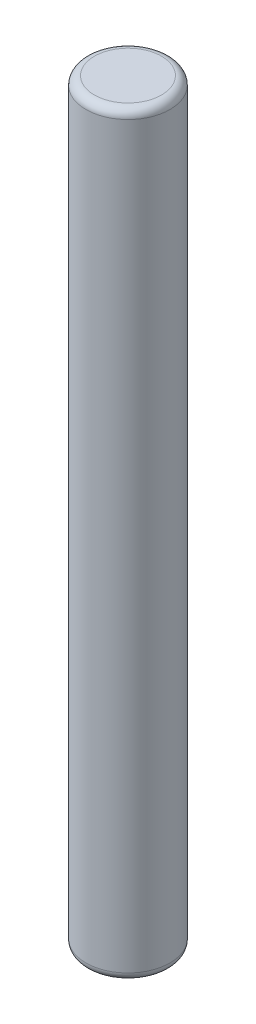
ISO-10303-21;
HEADER;
FILE_DESCRIPTION(('STEP AP214'),'2;1');
FILE_NAME('part.step','',(''),(''),'','','');
FILE_SCHEMA(('AUTOMOTIVE_DESIGN { 1 0 10303 214 1 1 1 1 }'));
ENDSEC;
DATA;
#1=APPLICATION_CONTEXT('core data for automotive mechanical design processes');
#2=APPLICATION_PROTOCOL_DEFINITION('international standard','automotive_design',2000,#1);
#3=PRODUCT_CONTEXT('',#1,'mechanical');
#4=PRODUCT('Part','Part','',(#3));
#5=PRODUCT_RELATED_PRODUCT_CATEGORY('part','',(#4));
#6=PRODUCT_DEFINITION_FORMATION('','',#4);
#7=PRODUCT_DEFINITION_CONTEXT('part definition',#1,'design');
#8=PRODUCT_DEFINITION('design','',#6,#7);
#9=PRODUCT_DEFINITION_SHAPE('','',#8);
#10=(LENGTH_UNIT() NAMED_UNIT(*) SI_UNIT(.MILLI.,.METRE.));
#11=(NAMED_UNIT(*) PLANE_ANGLE_UNIT() SI_UNIT($,.RADIAN.));
#12=(NAMED_UNIT(*) SI_UNIT($,.STERADIAN.) SOLID_ANGLE_UNIT());
#13=UNCERTAINTY_MEASURE_WITH_UNIT(LENGTH_MEASURE(1.E-05),#10,'distance_accuracy_value','');
#14=(GEOMETRIC_REPRESENTATION_CONTEXT(3) GLOBAL_UNCERTAINTY_ASSIGNED_CONTEXT((#13)) GLOBAL_UNIT_ASSIGNED_CONTEXT((#10,
#11,#12)) REPRESENTATION_CONTEXT('',''));
#15=CARTESIAN_POINT('',(0.,0.,0.));
#16=DIRECTION('',(0.,0.,1.));
#17=DIRECTION('',(1.,0.,0.));
#18=AXIS2_PLACEMENT_3D('',#15,#16,#17);
#19=CARTESIAN_POINT('',(0.,18.,0.));
#20=DIRECTION('',(0.,-1.,0.));
#21=DIRECTION('',(0.,0.,-1.));
#22=AXIS2_PLACEMENT_3D('',#19,#20,#21);
#23=CYLINDRICAL_SURFACE('',#22,1.);
#24=CARTESIAN_POINT('',(0.,0.199999999999999,0.));
#25=DIRECTION('',(0.,1.,0.));
#26=DIRECTION('',(0.,0.,1.));
#27=AXIS2_PLACEMENT_3D('',#24,#25,#26);
#28=CIRCLE('',#27,1.);
#29=CARTESIAN_POINT('',(0.,0.199999999999999,1.));
#30=VERTEX_POINT('',#29);
#31=EDGE_CURVE('E47',#30,#30,#28,.T.);
#32=ORIENTED_EDGE('',*,*,#31,.T.);
#33=EDGE_LOOP('',(#32));
#34=FACE_BOUND('',#33,.T.);
#35=CARTESIAN_POINT('',(0.,17.8,0.));
#36=DIRECTION('',(0.,1.,0.));
#37=DIRECTION('',(0.,0.,1.));
#38=AXIS2_PLACEMENT_3D('',#35,#36,#37);
#39=CIRCLE('',#38,1.);
#40=CARTESIAN_POINT('',(0.,17.8,1.));
#41=VERTEX_POINT('',#40);
#42=EDGE_CURVE('E51',#41,#41,#39,.F.);
#43=ORIENTED_EDGE('',*,*,#42,.T.);
#44=EDGE_LOOP('',(#43));
#45=FACE_BOUND('',#44,.T.);
#46=ADVANCED_FACE('F36',(#34,#45),#23,.T.);
#47=CARTESIAN_POINT('',(0.,18.,0.));
#48=DIRECTION('',(0.,1.,0.));
#49=DIRECTION('',(0.,0.,1.));
#50=AXIS2_PLACEMENT_3D('',#47,#48,#49);
#51=PLANE('',#50);
#52=CARTESIAN_POINT('',(0.,18.,0.));
#53=DIRECTION('',(0.,1.,0.));
#54=DIRECTION('',(0.,0.,1.));
#55=AXIS2_PLACEMENT_3D('',#52,#53,#54);
#56=CIRCLE('',#55,0.8);
#57=CARTESIAN_POINT('',(0.,18.,0.8));
#58=VERTEX_POINT('',#57);
#59=EDGE_CURVE('E10',#58,#58,#56,.T.);
#60=ORIENTED_EDGE('',*,*,#59,.T.);
#61=EDGE_LOOP('',(#60));
#62=FACE_BOUND('',#61,.T.);
#63=ADVANCED_FACE('F67',(#62),#51,.T.);
#64=CARTESIAN_POINT('',(0.,0.,0.));
#65=DIRECTION('',(0.,1.,0.));
#66=DIRECTION('',(0.,0.,1.));
#67=AXIS2_PLACEMENT_3D('',#64,#65,#66);
#68=PLANE('',#67);
#69=CARTESIAN_POINT('',(0.,0.,0.));
#70=DIRECTION('',(0.,1.,0.));
#71=DIRECTION('',(0.,0.,1.));
#72=AXIS2_PLACEMENT_3D('',#69,#70,#71);
#73=CIRCLE('',#72,0.8);
#74=CARTESIAN_POINT('',(0.,0.,0.8));
#75=VERTEX_POINT('',#74);
#76=EDGE_CURVE('E43',#75,#75,#73,.F.);
#77=ORIENTED_EDGE('',*,*,#76,.T.);
#78=EDGE_LOOP('',(#77));
#79=FACE_BOUND('',#78,.T.);
#80=ADVANCED_FACE('F64',(#79),#68,.F.);
#81=CARTESIAN_POINT('',(0.,0.199999999999999,0.));
#82=DIRECTION('',(0.,1.,0.));
#83=DIRECTION('',(0.,0.,1.));
#84=AXIS2_PLACEMENT_3D('',#81,#82,#83);
#85=TOROIDAL_SURFACE('',#84,0.8,0.2);
#86=ORIENTED_EDGE('',*,*,#76,.F.);
#87=EDGE_LOOP('',(#86));
#88=FACE_BOUND('',#87,.T.);
#89=ORIENTED_EDGE('',*,*,#31,.F.);
#90=EDGE_LOOP('',(#89));
#91=FACE_BOUND('',#90,.T.);
#92=ADVANCED_FACE('F60',(#88,#91),#85,.T.);
#93=CARTESIAN_POINT('',(0.,17.8,0.));
#94=DIRECTION('',(0.,1.,0.));
#95=DIRECTION('',(0.,0.,1.));
#96=AXIS2_PLACEMENT_3D('',#93,#94,#95);
#97=TOROIDAL_SURFACE('',#96,0.8,0.2);
#98=ORIENTED_EDGE('',*,*,#42,.F.);
#99=EDGE_LOOP('',(#98));
#100=FACE_BOUND('',#99,.T.);
#101=ORIENTED_EDGE('',*,*,#59,.F.);
#102=EDGE_LOOP('',(#101));
#103=FACE_BOUND('',#102,.T.);
#104=ADVANCED_FACE('F38',(#100,#103),#97,.T.);
#105=CLOSED_SHELL('',(#46,#63,#80,#92,#104));
#106=MANIFOLD_SOLID_BREP('B2',#105);
#107=ADVANCED_BREP_SHAPE_REPRESENTATION('',(#18,#106),#14);
#108=SHAPE_DEFINITION_REPRESENTATION(#9,#107);
ENDSEC;
END-ISO-10303-21;
